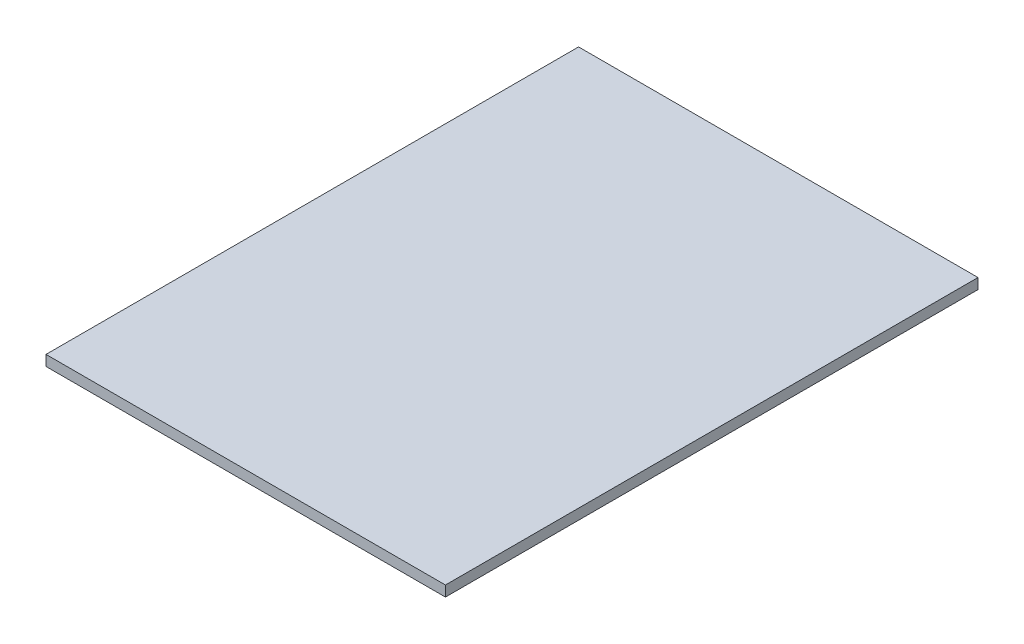
ISO-10303-21;
HEADER;
FILE_DESCRIPTION(('STEP AP214'),'2;1');
FILE_NAME('part.step','',(''),(''),'','','');
FILE_SCHEMA(('AUTOMOTIVE_DESIGN { 1 0 10303 214 1 1 1 1 }'));
ENDSEC;
DATA;
#1=APPLICATION_CONTEXT('core data for automotive mechanical design processes');
#2=APPLICATION_PROTOCOL_DEFINITION('international standard','automotive_design',2000,#1);
#3=PRODUCT_CONTEXT('',#1,'mechanical');
#4=PRODUCT('Part','Part','',(#3));
#5=PRODUCT_RELATED_PRODUCT_CATEGORY('part','',(#4));
#6=PRODUCT_DEFINITION_FORMATION('','',#4);
#7=PRODUCT_DEFINITION_CONTEXT('part definition',#1,'design');
#8=PRODUCT_DEFINITION('design','',#6,#7);
#9=PRODUCT_DEFINITION_SHAPE('','',#8);
#10=(LENGTH_UNIT() NAMED_UNIT(*) SI_UNIT(.MILLI.,.METRE.));
#11=(NAMED_UNIT(*) PLANE_ANGLE_UNIT() SI_UNIT($,.RADIAN.));
#12=(NAMED_UNIT(*) SI_UNIT($,.STERADIAN.) SOLID_ANGLE_UNIT());
#13=UNCERTAINTY_MEASURE_WITH_UNIT(LENGTH_MEASURE(1.E-05),#10,'distance_accuracy_value','');
#14=(GEOMETRIC_REPRESENTATION_CONTEXT(3) GLOBAL_UNCERTAINTY_ASSIGNED_CONTEXT((#13)) GLOBAL_UNIT_ASSIGNED_CONTEXT((#10,
#11,#12)) REPRESENTATION_CONTEXT('',''));
#15=CARTESIAN_POINT('',(0.,0.,0.));
#16=DIRECTION('',(0.,0.,1.));
#17=DIRECTION('',(1.,0.,0.));
#18=AXIS2_PLACEMENT_3D('',#15,#16,#17);
#19=CARTESIAN_POINT('',(-71.5333333333333,1.32142857142857,101.6));
#20=DIRECTION('',(1.,0.,0.));
#21=DIRECTION('',(0.,0.,-1.));
#22=AXIS2_PLACEMENT_3D('',#19,#20,#21);
#23=PLANE('',#22);
#24=DIRECTION('',(0.,-1.,0.));
#25=VECTOR('',#24,1.);
#26=CARTESIAN_POINT('',(-71.5333333333333,1.32142857142857,0.));
#27=LINE('',#26,#25);
#28=CARTESIAN_POINT('',(-71.5333333333333,1.32142857142857,0.));
#29=VERTEX_POINT('',#28);
#30=CARTESIAN_POINT('',(-71.5333333333333,-0.678571428571429,0.));
#31=VERTEX_POINT('',#30);
#32=EDGE_CURVE('E104',#29,#31,#27,.T.);
#33=ORIENTED_EDGE('',*,*,#32,.T.);
#34=DIRECTION('',(0.,0.,-1.));
#35=VECTOR('',#34,1.);
#36=CARTESIAN_POINT('',(-71.5333333333333,-0.678571428571429,101.6));
#37=LINE('',#36,#35);
#38=CARTESIAN_POINT('',(-71.5333333333333,-0.678571428571429,101.6));
#39=VERTEX_POINT('',#38);
#40=EDGE_CURVE('E11',#39,#31,#37,.T.);
#41=ORIENTED_EDGE('',*,*,#40,.F.);
#42=DIRECTION('',(0.,-1.,0.));
#43=VECTOR('',#42,1.);
#44=CARTESIAN_POINT('',(-71.5333333333333,1.32142857142857,101.6));
#45=LINE('',#44,#43);
#46=CARTESIAN_POINT('',(-71.5333333333333,1.32142857142857,101.6));
#47=VERTEX_POINT('',#46);
#48=EDGE_CURVE('E92',#47,#39,#45,.T.);
#49=ORIENTED_EDGE('',*,*,#48,.F.);
#50=DIRECTION('',(0.,0.,-1.));
#51=VECTOR('',#50,1.);
#52=CARTESIAN_POINT('',(-71.5333333333333,1.32142857142857,101.6));
#53=LINE('',#52,#51);
#54=EDGE_CURVE('E100',#47,#29,#53,.T.);
#55=ORIENTED_EDGE('',*,*,#54,.T.);
#56=EDGE_LOOP('',(#33,#41,#49,#55));
#57=FACE_BOUND('',#56,.T.);
#58=ADVANCED_FACE('F41',(#57),#23,.F.);
#59=CARTESIAN_POINT('',(-71.5333333333333,-0.678571428571429,101.6));
#60=DIRECTION('',(0.,1.,0.));
#61=DIRECTION('',(-1.,0.,0.));
#62=AXIS2_PLACEMENT_3D('',#59,#60,#61);
#63=PLANE('',#62);
#64=DIRECTION('',(1.,0.,0.));
#65=VECTOR('',#64,1.);
#66=CARTESIAN_POINT('',(-71.5333333333333,-0.678571428571429,0.));
#67=LINE('',#66,#65);
#68=CARTESIAN_POINT('',(4.66666666666666,-0.678571428571429,0.));
#69=VERTEX_POINT('',#68);
#70=EDGE_CURVE('E96',#31,#69,#67,.T.);
#71=ORIENTED_EDGE('',*,*,#70,.T.);
#72=DIRECTION('',(0.,0.,-1.));
#73=VECTOR('',#72,1.);
#74=CARTESIAN_POINT('',(4.66666666666666,-0.678571428571429,101.6));
#75=LINE('',#74,#73);
#76=CARTESIAN_POINT('',(4.66666666666666,-0.678571428571429,101.6));
#77=VERTEX_POINT('',#76);
#78=EDGE_CURVE('E49',#77,#69,#75,.T.);
#79=ORIENTED_EDGE('',*,*,#78,.F.);
#80=DIRECTION('',(1.,0.,0.));
#81=VECTOR('',#80,1.);
#82=CARTESIAN_POINT('',(-71.5333333333333,-0.678571428571429,101.6));
#83=LINE('',#82,#81);
#84=EDGE_CURVE('E87',#39,#77,#83,.T.);
#85=ORIENTED_EDGE('',*,*,#84,.F.);
#86=ORIENTED_EDGE('',*,*,#40,.T.);
#87=EDGE_LOOP('',(#71,#79,#85,#86));
#88=FACE_BOUND('',#87,.T.);
#89=ADVANCED_FACE('F95',(#88),#63,.F.);
#90=CARTESIAN_POINT('',(4.66666666666666,1.32142857142857,101.6));
#91=DIRECTION('',(-1.,0.,0.));
#92=DIRECTION('',(0.,0.,1.));
#93=AXIS2_PLACEMENT_3D('',#90,#91,#92);
#94=PLANE('',#93);
#95=DIRECTION('',(0.,1.,0.));
#96=VECTOR('',#95,1.);
#97=CARTESIAN_POINT('',(4.66666666666666,1.32142857142857,0.));
#98=LINE('',#97,#96);
#99=CARTESIAN_POINT('',(4.66666666666666,1.32142857142857,0.));
#100=VERTEX_POINT('',#99);
#101=EDGE_CURVE('E74',#69,#100,#98,.T.);
#102=ORIENTED_EDGE('',*,*,#101,.T.);
#103=DIRECTION('',(0.,0.,-1.));
#104=VECTOR('',#103,1.);
#105=CARTESIAN_POINT('',(4.66666666666666,1.32142857142857,101.6));
#106=LINE('',#105,#104);
#107=CARTESIAN_POINT('',(4.66666666666666,1.32142857142857,101.6));
#108=VERTEX_POINT('',#107);
#109=EDGE_CURVE('E97',#108,#100,#106,.T.);
#110=ORIENTED_EDGE('',*,*,#109,.F.);
#111=DIRECTION('',(0.,1.,0.));
#112=VECTOR('',#111,1.);
#113=CARTESIAN_POINT('',(4.66666666666666,1.32142857142857,101.6));
#114=LINE('',#113,#112);
#115=EDGE_CURVE('E90',#77,#108,#114,.T.);
#116=ORIENTED_EDGE('',*,*,#115,.F.);
#117=ORIENTED_EDGE('',*,*,#78,.T.);
#118=EDGE_LOOP('',(#102,#110,#116,#117));
#119=FACE_BOUND('',#118,.T.);
#120=ADVANCED_FACE('F98',(#119),#94,.F.);
#121=CARTESIAN_POINT('',(-71.5333333333333,1.32142857142857,101.6));
#122=DIRECTION('',(0.,-1.,0.));
#123=DIRECTION('',(0.,0.,-1.));
#124=AXIS2_PLACEMENT_3D('',#121,#122,#123);
#125=PLANE('',#124);
#126=DIRECTION('',(-1.,0.,0.));
#127=VECTOR('',#126,1.);
#128=CARTESIAN_POINT('',(-71.5333333333333,1.32142857142857,0.));
#129=LINE('',#128,#127);
#130=EDGE_CURVE('E80',#100,#29,#129,.T.);
#131=ORIENTED_EDGE('',*,*,#130,.T.);
#132=ORIENTED_EDGE('',*,*,#54,.F.);
#133=DIRECTION('',(-1.,0.,0.));
#134=VECTOR('',#133,1.);
#135=CARTESIAN_POINT('',(-71.5333333333333,1.32142857142857,101.6));
#136=LINE('',#135,#134);
#137=EDGE_CURVE('E57',#108,#47,#136,.T.);
#138=ORIENTED_EDGE('',*,*,#137,.F.);
#139=ORIENTED_EDGE('',*,*,#109,.T.);
#140=EDGE_LOOP('',(#131,#132,#138,#139));
#141=FACE_BOUND('',#140,.T.);
#142=ADVANCED_FACE('F111',(#141),#125,.F.);
#143=CARTESIAN_POINT('',(0.,0.,101.6));
#144=DIRECTION('',(0.,0.,1.));
#145=DIRECTION('',(1.,0.,0.));
#146=AXIS2_PLACEMENT_3D('',#143,#144,#145);
#147=PLANE('',#146);
#148=ORIENTED_EDGE('',*,*,#48,.T.);
#149=ORIENTED_EDGE('',*,*,#84,.T.);
#150=ORIENTED_EDGE('',*,*,#115,.T.);
#151=ORIENTED_EDGE('',*,*,#137,.T.);
#152=EDGE_LOOP('',(#148,#149,#150,#151));
#153=FACE_BOUND('',#152,.T.);
#154=ADVANCED_FACE('F88',(#153),#147,.T.);
#155=CARTESIAN_POINT('',(0.,0.,0.));
#156=DIRECTION('',(0.,0.,1.));
#157=DIRECTION('',(1.,0.,0.));
#158=AXIS2_PLACEMENT_3D('',#155,#156,#157);
#159=PLANE('',#158);
#160=ORIENTED_EDGE('',*,*,#32,.F.);
#161=ORIENTED_EDGE('',*,*,#130,.F.);
#162=ORIENTED_EDGE('',*,*,#101,.F.);
#163=ORIENTED_EDGE('',*,*,#70,.F.);
#164=EDGE_LOOP('',(#160,#161,#162,#163));
#165=FACE_BOUND('',#164,.T.);
#166=ADVANCED_FACE('F114',(#165),#159,.F.);
#167=CLOSED_SHELL('',(#58,#89,#120,#142,#154,#166));
#168=MANIFOLD_SOLID_BREP('B2',#167);
#169=ADVANCED_BREP_SHAPE_REPRESENTATION('',(#18,#168),#14);
#170=SHAPE_DEFINITION_REPRESENTATION(#9,#169);
ENDSEC;
END-ISO-10303-21;
